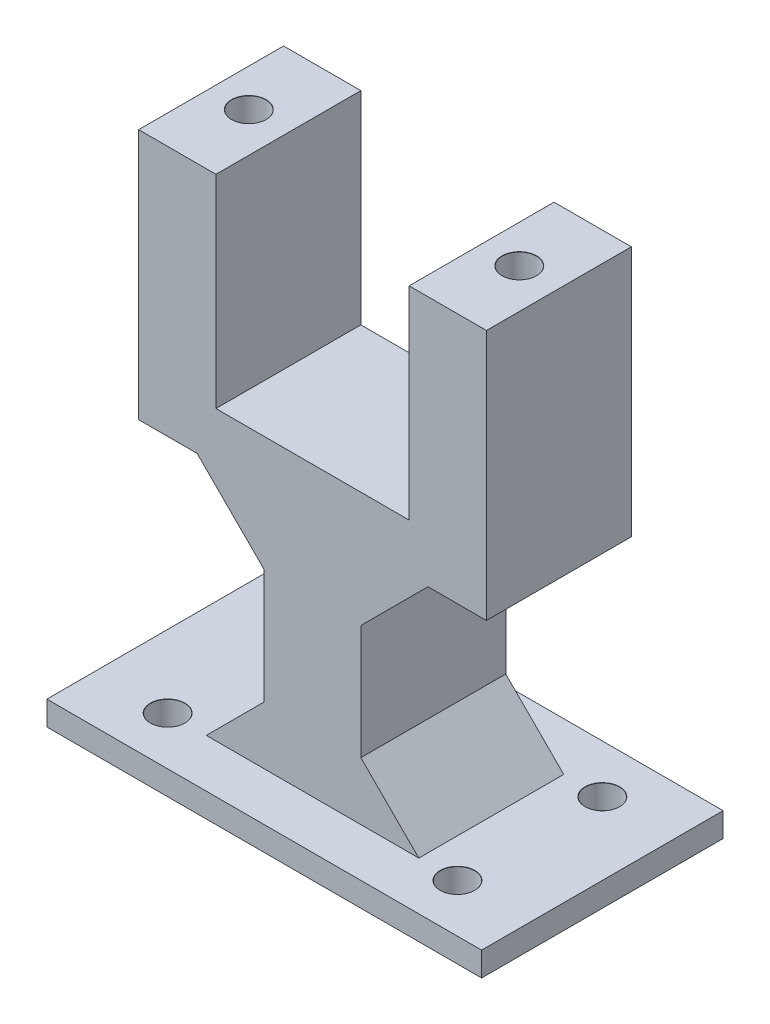
ISO-10303-21;
HEADER;
FILE_DESCRIPTION(('STEP AP214'),'2;1');
FILE_NAME('part.step','',(''),(''),'','','');
FILE_SCHEMA(('AUTOMOTIVE_DESIGN { 1 0 10303 214 1 1 1 1 }'));
ENDSEC;
DATA;
#1=APPLICATION_CONTEXT('core data for automotive mechanical design processes');
#2=APPLICATION_PROTOCOL_DEFINITION('international standard','automotive_design',2000,#1);
#3=PRODUCT_CONTEXT('',#1,'mechanical');
#4=PRODUCT('Part','Part','',(#3));
#5=PRODUCT_RELATED_PRODUCT_CATEGORY('part','',(#4));
#6=PRODUCT_DEFINITION_FORMATION('','',#4);
#7=PRODUCT_DEFINITION_CONTEXT('part definition',#1,'design');
#8=PRODUCT_DEFINITION('design','',#6,#7);
#9=PRODUCT_DEFINITION_SHAPE('','',#8);
#10=(LENGTH_UNIT() NAMED_UNIT(*) SI_UNIT(.MILLI.,.METRE.));
#11=(NAMED_UNIT(*) PLANE_ANGLE_UNIT() SI_UNIT($,.RADIAN.));
#12=(NAMED_UNIT(*) SI_UNIT($,.STERADIAN.) SOLID_ANGLE_UNIT());
#13=UNCERTAINTY_MEASURE_WITH_UNIT(LENGTH_MEASURE(1.E-05),#10,'distance_accuracy_value','');
#14=(GEOMETRIC_REPRESENTATION_CONTEXT(3) GLOBAL_UNCERTAINTY_ASSIGNED_CONTEXT((#13)) GLOBAL_UNIT_ASSIGNED_CONTEXT((#10,
#11,#12)) REPRESENTATION_CONTEXT('',''));
#15=CARTESIAN_POINT('',(0.,0.,0.));
#16=DIRECTION('',(0.,0.,1.));
#17=DIRECTION('',(1.,0.,0.));
#18=AXIS2_PLACEMENT_3D('',#15,#16,#17);
#19=CARTESIAN_POINT('',(-6.35,3.175,9.525));
#20=DIRECTION('',(1.,0.,0.));
#21=DIRECTION('',(0.,1.,0.));
#22=AXIS2_PLACEMENT_3D('',#19,#20,#21);
#23=PLANE('',#22);
#24=DIRECTION('',(0.,0.,-1.));
#25=VECTOR('',#24,1.);
#26=CARTESIAN_POINT('',(-6.35,10.795,9.525));
#27=LINE('',#26,#25);
#28=CARTESIAN_POINT('',(-6.35,10.795,9.525));
#29=VERTEX_POINT('',#28);
#30=CARTESIAN_POINT('',(-6.35,10.795,-9.525));
#31=VERTEX_POINT('',#30);
#32=EDGE_CURVE('E816',#29,#31,#27,.T.);
#33=ORIENTED_EDGE('',*,*,#32,.F.);
#34=DIRECTION('',(0.,-1.,0.));
#35=VECTOR('',#34,1.);
#36=CARTESIAN_POINT('',(-6.35,3.175,9.525));
#37=LINE('',#36,#35);
#38=CARTESIAN_POINT('',(-6.35,25.8459459212804,9.525));
#39=VERTEX_POINT('',#38);
#40=EDGE_CURVE('E197',#39,#29,#37,.T.);
#41=ORIENTED_EDGE('',*,*,#40,.F.);
#42=DIRECTION('',(0.,0.,-1.));
#43=VECTOR('',#42,1.);
#44=CARTESIAN_POINT('',(-6.34999999999999,25.8459459212804,9.525));
#45=LINE('',#44,#43);
#46=CARTESIAN_POINT('',(-6.34999999999999,25.8459459212804,-9.525));
#47=VERTEX_POINT('',#46);
#48=EDGE_CURVE('E195',#39,#47,#45,.T.);
#49=ORIENTED_EDGE('',*,*,#48,.T.);
#50=DIRECTION('',(0.,-1.,0.));
#51=VECTOR('',#50,1.);
#52=CARTESIAN_POINT('',(-6.35,3.175,-9.525));
#53=LINE('',#52,#51);
#54=EDGE_CURVE('E182',#47,#31,#53,.T.);
#55=ORIENTED_EDGE('',*,*,#54,.T.);
#56=EDGE_LOOP('',(#33,#41,#49,#55));
#57=FACE_BOUND('',#56,.T.);
#58=ADVANCED_FACE('F46',(#57),#23,.F.);
#59=CARTESIAN_POINT('',(0.,3.175,0.));
#60=DIRECTION('',(0.,1.,0.));
#61=DIRECTION('',(0.,0.,1.));
#62=AXIS2_PLACEMENT_3D('',#59,#60,#61);
#63=PLANE('',#62);
#64=CARTESIAN_POINT('',(-19.05,3.175,-9.525));
#65=DIRECTION('',(0.,1.,0.));
#66=DIRECTION('',(0.,0.,1.));
#67=AXIS2_PLACEMENT_3D('',#64,#65,#66);
#68=CIRCLE('',#67,2.275);
#69=CARTESIAN_POINT('',(-19.05,3.175,-7.25));
#70=VERTEX_POINT('',#69);
#71=EDGE_CURVE('E284',#70,#70,#68,.T.);
#72=ORIENTED_EDGE('',*,*,#71,.F.);
#73=EDGE_LOOP('',(#72));
#74=FACE_BOUND('',#73,.T.);
#75=CARTESIAN_POINT('',(19.05,3.175,-9.525));
#76=DIRECTION('',(0.,1.,0.));
#77=DIRECTION('',(0.,0.,1.));
#78=AXIS2_PLACEMENT_3D('',#75,#76,#77);
#79=CIRCLE('',#78,2.275);
#80=CARTESIAN_POINT('',(19.05,3.175,-7.25));
#81=VERTEX_POINT('',#80);
#82=EDGE_CURVE('E298',#81,#81,#79,.T.);
#83=ORIENTED_EDGE('',*,*,#82,.F.);
#84=EDGE_LOOP('',(#83));
#85=FACE_BOUND('',#84,.T.);
#86=CARTESIAN_POINT('',(19.05,3.175,9.525));
#87=DIRECTION('',(0.,1.,0.));
#88=DIRECTION('',(0.,0.,1.));
#89=AXIS2_PLACEMENT_3D('',#86,#87,#88);
#90=CIRCLE('',#89,2.275);
#91=CARTESIAN_POINT('',(19.05,3.175,11.8));
#92=VERTEX_POINT('',#91);
#93=EDGE_CURVE('E307',#92,#92,#90,.T.);
#94=ORIENTED_EDGE('',*,*,#93,.F.);
#95=EDGE_LOOP('',(#94));
#96=FACE_BOUND('',#95,.T.);
#97=CARTESIAN_POINT('',(-19.05,3.175,9.525));
#98=DIRECTION('',(0.,1.,0.));
#99=DIRECTION('',(0.,0.,1.));
#100=AXIS2_PLACEMENT_3D('',#97,#98,#99);
#101=CIRCLE('',#100,2.275);
#102=CARTESIAN_POINT('',(-19.05,3.175,11.8));
#103=VERTEX_POINT('',#102);
#104=EDGE_CURVE('E316',#103,#103,#101,.T.);
#105=ORIENTED_EDGE('',*,*,#104,.F.);
#106=EDGE_LOOP('',(#105));
#107=FACE_BOUND('',#106,.T.);
#108=DIRECTION('',(0.,0.,1.));
#109=VECTOR('',#108,1.);
#110=CARTESIAN_POINT('',(-28.575,3.175,-15.875));
#111=LINE('',#110,#109);
#112=CARTESIAN_POINT('',(-28.575,3.175,-15.875));
#113=VERTEX_POINT('',#112);
#114=CARTESIAN_POINT('',(-28.575,3.175,15.875));
#115=VERTEX_POINT('',#114);
#116=EDGE_CURVE('E326',#113,#115,#111,.T.);
#117=ORIENTED_EDGE('',*,*,#116,.T.);
#118=DIRECTION('',(1.,0.,0.));
#119=VECTOR('',#118,1.);
#120=CARTESIAN_POINT('',(-28.575,3.175,15.875));
#121=LINE('',#120,#119);
#122=CARTESIAN_POINT('',(28.575,3.175,15.875));
#123=VERTEX_POINT('',#122);
#124=EDGE_CURVE('E329',#115,#123,#121,.T.);
#125=ORIENTED_EDGE('',*,*,#124,.T.);
#126=DIRECTION('',(0.,0.,-1.));
#127=VECTOR('',#126,1.);
#128=CARTESIAN_POINT('',(28.575,3.175,-15.875));
#129=LINE('',#128,#127);
#130=CARTESIAN_POINT('',(28.575,3.175,-15.875));
#131=VERTEX_POINT('',#130);
#132=EDGE_CURVE('E332',#123,#131,#129,.T.);
#133=ORIENTED_EDGE('',*,*,#132,.T.);
#134=DIRECTION('',(-1.,0.,0.));
#135=VECTOR('',#134,1.);
#136=CARTESIAN_POINT('',(-28.575,3.175,-15.875));
#137=LINE('',#136,#135);
#138=EDGE_CURVE('E334',#131,#113,#137,.T.);
#139=ORIENTED_EDGE('',*,*,#138,.T.);
#140=EDGE_LOOP('',(#117,#125,#133,#139));
#141=FACE_BOUND('',#140,.T.);
#142=DIRECTION('',(1.,0.,0.));
#143=VECTOR('',#142,1.);
#144=CARTESIAN_POINT('',(-6.35,3.175,9.525));
#145=LINE('',#144,#143);
#146=CARTESIAN_POINT('',(-13.9700000000001,3.175,9.525));
#147=VERTEX_POINT('',#146);
#148=CARTESIAN_POINT('',(13.9700000000001,3.175,9.525));
#149=VERTEX_POINT('',#148);
#150=EDGE_CURVE('E61',#147,#149,#145,.T.);
#151=ORIENTED_EDGE('',*,*,#150,.F.);
#152=DIRECTION('',(0.,0.,-1.));
#153=VECTOR('',#152,1.);
#154=CARTESIAN_POINT('',(-13.9700000000001,3.175,9.525));
#155=LINE('',#154,#153);
#156=CARTESIAN_POINT('',(-13.9700000000001,3.175,-9.525));
#157=VERTEX_POINT('',#156);
#158=EDGE_CURVE('E815',#147,#157,#155,.T.);
#159=ORIENTED_EDGE('',*,*,#158,.T.);
#160=DIRECTION('',(1.,0.,0.));
#161=VECTOR('',#160,1.);
#162=CARTESIAN_POINT('',(-6.35,3.175,-9.525));
#163=LINE('',#162,#161);
#164=CARTESIAN_POINT('',(13.9700000000001,3.175,-9.525));
#165=VERTEX_POINT('',#164);
#166=EDGE_CURVE('E69',#157,#165,#163,.T.);
#167=ORIENTED_EDGE('',*,*,#166,.T.);
#168=DIRECTION('',(0.,0.,-1.));
#169=VECTOR('',#168,1.);
#170=CARTESIAN_POINT('',(13.9700000000001,3.175,9.525));
#171=LINE('',#170,#169);
#172=EDGE_CURVE('E221',#149,#165,#171,.T.);
#173=ORIENTED_EDGE('',*,*,#172,.F.);
#174=EDGE_LOOP('',(#151,#159,#167,#173));
#175=FACE_BOUND('',#174,.T.);
#176=ADVANCED_FACE('F368',(#74,#85,#96,#107,#141,#175),#63,.T.);
#177=CARTESIAN_POINT('',(6.35,3.175,9.525));
#178=DIRECTION('',(-1.,0.,0.));
#179=DIRECTION('',(0.,-1.,0.));
#180=AXIS2_PLACEMENT_3D('',#177,#178,#179);
#181=PLANE('',#180);
#182=DIRECTION('',(0.,0.,-1.));
#183=VECTOR('',#182,1.);
#184=CARTESIAN_POINT('',(6.35,10.795,9.525));
#185=LINE('',#184,#183);
#186=CARTESIAN_POINT('',(6.35,10.795,9.525));
#187=VERTEX_POINT('',#186);
#188=CARTESIAN_POINT('',(6.35,10.795,-9.525));
#189=VERTEX_POINT('',#188);
#190=EDGE_CURVE('E230',#187,#189,#185,.T.);
#191=ORIENTED_EDGE('',*,*,#190,.T.);
#192=DIRECTION('',(0.,1.,0.));
#193=VECTOR('',#192,1.);
#194=CARTESIAN_POINT('',(6.35,3.175,-9.525));
#195=LINE('',#194,#193);
#196=CARTESIAN_POINT('',(6.35,25.8459459212804,-9.525));
#197=VERTEX_POINT('',#196);
#198=EDGE_CURVE('E287',#189,#197,#195,.T.);
#199=ORIENTED_EDGE('',*,*,#198,.T.);
#200=DIRECTION('',(0.,0.,-1.));
#201=VECTOR('',#200,1.);
#202=CARTESIAN_POINT('',(6.35,25.8459459212804,9.525));
#203=LINE('',#202,#201);
#204=CARTESIAN_POINT('',(6.35,25.8459459212804,9.525));
#205=VERTEX_POINT('',#204);
#206=EDGE_CURVE('E192',#205,#197,#203,.T.);
#207=ORIENTED_EDGE('',*,*,#206,.F.);
#208=DIRECTION('',(0.,1.,0.));
#209=VECTOR('',#208,1.);
#210=CARTESIAN_POINT('',(6.35,3.175,9.525));
#211=LINE('',#210,#209);
#212=EDGE_CURVE('E281',#187,#205,#211,.T.);
#213=ORIENTED_EDGE('',*,*,#212,.F.);
#214=EDGE_LOOP('',(#191,#199,#207,#213));
#215=FACE_BOUND('',#214,.T.);
#216=ADVANCED_FACE('F376',(#215),#181,.F.);
#217=CARTESIAN_POINT('',(-28.575,3.175,-15.875));
#218=DIRECTION('',(1.,0.,0.));
#219=DIRECTION('',(0.,0.,-1.));
#220=AXIS2_PLACEMENT_3D('',#217,#218,#219);
#221=PLANE('',#220);
#222=DIRECTION('',(0.,0.,1.));
#223=VECTOR('',#222,1.);
#224=CARTESIAN_POINT('',(-28.575,0.,-15.875));
#225=LINE('',#224,#223);
#226=CARTESIAN_POINT('',(-28.575,0.,-15.875));
#227=VERTEX_POINT('',#226);
#228=CARTESIAN_POINT('',(-28.575,0.,15.875));
#229=VERTEX_POINT('',#228);
#230=EDGE_CURVE('E325',#227,#229,#225,.T.);
#231=ORIENTED_EDGE('',*,*,#230,.T.);
#232=DIRECTION('',(0.,-1.,0.));
#233=VECTOR('',#232,1.);
#234=CARTESIAN_POINT('',(-28.575,3.175,15.875));
#235=LINE('',#234,#233);
#236=EDGE_CURVE('E11',#115,#229,#235,.T.);
#237=ORIENTED_EDGE('',*,*,#236,.F.);
#238=ORIENTED_EDGE('',*,*,#116,.F.);
#239=DIRECTION('',(0.,-1.,0.));
#240=VECTOR('',#239,1.);
#241=CARTESIAN_POINT('',(-28.575,3.175,-15.875));
#242=LINE('',#241,#240);
#243=EDGE_CURVE('E336',#113,#227,#242,.T.);
#244=ORIENTED_EDGE('',*,*,#243,.T.);
#245=EDGE_LOOP('',(#231,#237,#238,#244));
#246=FACE_BOUND('',#245,.T.);
#247=ADVANCED_FACE('F48',(#246),#221,.F.);
#248=CARTESIAN_POINT('',(-28.575,3.175,15.875));
#249=DIRECTION('',(0.,0.,-1.));
#250=DIRECTION('',(-1.,0.,0.));
#251=AXIS2_PLACEMENT_3D('',#248,#249,#250);
#252=PLANE('',#251);
#253=DIRECTION('',(1.,0.,0.));
#254=VECTOR('',#253,1.);
#255=CARTESIAN_POINT('',(-28.575,0.,15.875));
#256=LINE('',#255,#254);
#257=CARTESIAN_POINT('',(28.575,0.,15.875));
#258=VERTEX_POINT('',#257);
#259=EDGE_CURVE('E339',#229,#258,#256,.T.);
#260=ORIENTED_EDGE('',*,*,#259,.T.);
#261=DIRECTION('',(0.,-1.,0.));
#262=VECTOR('',#261,1.);
#263=CARTESIAN_POINT('',(28.575,3.175,15.875));
#264=LINE('',#263,#262);
#265=EDGE_CURVE('E54',#123,#258,#264,.T.);
#266=ORIENTED_EDGE('',*,*,#265,.F.);
#267=ORIENTED_EDGE('',*,*,#124,.F.);
#268=ORIENTED_EDGE('',*,*,#236,.T.);
#269=EDGE_LOOP('',(#260,#266,#267,#268));
#270=FACE_BOUND('',#269,.T.);
#271=ADVANCED_FACE('F369',(#270),#252,.F.);
#272=CARTESIAN_POINT('',(28.575,3.175,-15.875));
#273=DIRECTION('',(-1.,0.,0.));
#274=DIRECTION('',(0.,0.,1.));
#275=AXIS2_PLACEMENT_3D('',#272,#273,#274);
#276=PLANE('',#275);
#277=DIRECTION('',(0.,0.,-1.));
#278=VECTOR('',#277,1.);
#279=CARTESIAN_POINT('',(28.575,0.,-15.875));
#280=LINE('',#279,#278);
#281=CARTESIAN_POINT('',(28.575,0.,-15.875));
#282=VERTEX_POINT('',#281);
#283=EDGE_CURVE('E341',#258,#282,#280,.T.);
#284=ORIENTED_EDGE('',*,*,#283,.T.);
#285=DIRECTION('',(0.,-1.,0.));
#286=VECTOR('',#285,1.);
#287=CARTESIAN_POINT('',(28.575,3.175,-15.875));
#288=LINE('',#287,#286);
#289=EDGE_CURVE('E346',#131,#282,#288,.T.);
#290=ORIENTED_EDGE('',*,*,#289,.F.);
#291=ORIENTED_EDGE('',*,*,#132,.F.);
#292=ORIENTED_EDGE('',*,*,#265,.T.);
#293=EDGE_LOOP('',(#284,#290,#291,#292));
#294=FACE_BOUND('',#293,.T.);
#295=ADVANCED_FACE('F353',(#294),#276,.F.);
#296=CARTESIAN_POINT('',(-28.575,3.175,-15.875));
#297=DIRECTION('',(0.,0.,1.));
#298=DIRECTION('',(1.,0.,0.));
#299=AXIS2_PLACEMENT_3D('',#296,#297,#298);
#300=PLANE('',#299);
#301=DIRECTION('',(-1.,0.,0.));
#302=VECTOR('',#301,1.);
#303=CARTESIAN_POINT('',(-28.575,0.,-15.875));
#304=LINE('',#303,#302);
#305=EDGE_CURVE('E330',#282,#227,#304,.T.);
#306=ORIENTED_EDGE('',*,*,#305,.T.);
#307=ORIENTED_EDGE('',*,*,#243,.F.);
#308=ORIENTED_EDGE('',*,*,#138,.F.);
#309=ORIENTED_EDGE('',*,*,#289,.T.);
#310=EDGE_LOOP('',(#306,#307,#308,#309));
#311=FACE_BOUND('',#310,.T.);
#312=ADVANCED_FACE('F362',(#311),#300,.F.);
#313=CARTESIAN_POINT('',(0.,0.,0.));
#314=DIRECTION('',(0.,1.,0.));
#315=DIRECTION('',(0.,0.,1.));
#316=AXIS2_PLACEMENT_3D('',#313,#314,#315);
#317=PLANE('',#316);
#318=CARTESIAN_POINT('',(-19.05,0.,-9.525));
#319=DIRECTION('',(0.,1.,0.));
#320=DIRECTION('',(0.,0.,1.));
#321=AXIS2_PLACEMENT_3D('',#318,#319,#320);
#322=CIRCLE('',#321,2.25);
#323=CARTESIAN_POINT('',(-19.05,0.,-7.27500000000001));
#324=VERTEX_POINT('',#323);
#325=EDGE_CURVE('E295',#324,#324,#322,.T.);
#326=ORIENTED_EDGE('',*,*,#325,.T.);
#327=EDGE_LOOP('',(#326));
#328=FACE_BOUND('',#327,.T.);
#329=CARTESIAN_POINT('',(19.05,0.,-9.525));
#330=DIRECTION('',(0.,1.,0.));
#331=DIRECTION('',(0.,0.,1.));
#332=AXIS2_PLACEMENT_3D('',#329,#330,#331);
#333=CIRCLE('',#332,2.25);
#334=CARTESIAN_POINT('',(19.05,0.,-7.27500000000001));
#335=VERTEX_POINT('',#334);
#336=EDGE_CURVE('E304',#335,#335,#333,.T.);
#337=ORIENTED_EDGE('',*,*,#336,.T.);
#338=EDGE_LOOP('',(#337));
#339=FACE_BOUND('',#338,.T.);
#340=CARTESIAN_POINT('',(19.05,0.,9.525));
#341=DIRECTION('',(0.,1.,0.));
#342=DIRECTION('',(0.,0.,1.));
#343=AXIS2_PLACEMENT_3D('',#340,#341,#342);
#344=CIRCLE('',#343,2.25);
#345=CARTESIAN_POINT('',(19.05,0.,11.775));
#346=VERTEX_POINT('',#345);
#347=EDGE_CURVE('E313',#346,#346,#344,.T.);
#348=ORIENTED_EDGE('',*,*,#347,.T.);
#349=EDGE_LOOP('',(#348));
#350=FACE_BOUND('',#349,.T.);
#351=CARTESIAN_POINT('',(-19.05,0.,9.525));
#352=DIRECTION('',(0.,1.,0.));
#353=DIRECTION('',(0.,0.,1.));
#354=AXIS2_PLACEMENT_3D('',#351,#352,#353);
#355=CIRCLE('',#354,2.25);
#356=CARTESIAN_POINT('',(-19.05,0.,11.775));
#357=VERTEX_POINT('',#356);
#358=EDGE_CURVE('E322',#357,#357,#355,.T.);
#359=ORIENTED_EDGE('',*,*,#358,.T.);
#360=EDGE_LOOP('',(#359));
#361=FACE_BOUND('',#360,.T.);
#362=ORIENTED_EDGE('',*,*,#230,.F.);
#363=ORIENTED_EDGE('',*,*,#305,.F.);
#364=ORIENTED_EDGE('',*,*,#283,.F.);
#365=ORIENTED_EDGE('',*,*,#259,.F.);
#366=EDGE_LOOP('',(#362,#363,#364,#365));
#367=FACE_BOUND('',#366,.T.);
#368=ADVANCED_FACE('F359',(#328,#339,#350,#361,#367),#317,.F.);
#369=CARTESIAN_POINT('',(-19.05,3.175,9.525));
#370=DIRECTION('',(0.,1.,0.));
#371=DIRECTION('',(0.,0.,1.));
#372=AXIS2_PLACEMENT_3D('',#369,#370,#371);
#373=CYLINDRICAL_SURFACE('',#372,2.25);
#374=ORIENTED_EDGE('',*,*,#358,.F.);
#375=EDGE_LOOP('',(#374));
#376=FACE_BOUND('',#375,.T.);
#377=CARTESIAN_POINT('',(-19.05,3.15,9.525));
#378=DIRECTION('',(0.,1.,0.));
#379=DIRECTION('',(0.,0.,1.));
#380=AXIS2_PLACEMENT_3D('',#377,#378,#379);
#381=CIRCLE('',#380,2.25);
#382=CARTESIAN_POINT('',(-19.05,3.15,11.775));
#383=VERTEX_POINT('',#382);
#384=EDGE_CURVE('E319',#383,#383,#381,.T.);
#385=ORIENTED_EDGE('',*,*,#384,.T.);
#386=EDGE_LOOP('',(#385));
#387=FACE_BOUND('',#386,.T.);
#388=ADVANCED_FACE('F415',(#376,#387),#373,.F.);
#389=CARTESIAN_POINT('',(-19.05,3.175,9.525));
#390=DIRECTION('',(0.,1.,0.));
#391=DIRECTION('',(0.,0.,1.));
#392=AXIS2_PLACEMENT_3D('',#389,#390,#391);
#393=CONICAL_SURFACE('',#392,2.275,0.78539816339744);
#394=ORIENTED_EDGE('',*,*,#384,.F.);
#395=EDGE_LOOP('',(#394));
#396=FACE_BOUND('',#395,.T.);
#397=ORIENTED_EDGE('',*,*,#104,.T.);
#398=EDGE_LOOP('',(#397));
#399=FACE_BOUND('',#398,.T.);
#400=ADVANCED_FACE('F411',(#396,#399),#393,.F.);
#401=CARTESIAN_POINT('',(19.05,3.175,9.525));
#402=DIRECTION('',(0.,1.,0.));
#403=DIRECTION('',(0.,0.,1.));
#404=AXIS2_PLACEMENT_3D('',#401,#402,#403);
#405=CYLINDRICAL_SURFACE('',#404,2.25);
#406=ORIENTED_EDGE('',*,*,#347,.F.);
#407=EDGE_LOOP('',(#406));
#408=FACE_BOUND('',#407,.T.);
#409=CARTESIAN_POINT('',(19.05,3.15,9.525));
#410=DIRECTION('',(0.,1.,0.));
#411=DIRECTION('',(0.,0.,1.));
#412=AXIS2_PLACEMENT_3D('',#409,#410,#411);
#413=CIRCLE('',#412,2.25);
#414=CARTESIAN_POINT('',(19.05,3.15,11.775));
#415=VERTEX_POINT('',#414);
#416=EDGE_CURVE('E310',#415,#415,#413,.T.);
#417=ORIENTED_EDGE('',*,*,#416,.T.);
#418=EDGE_LOOP('',(#417));
#419=FACE_BOUND('',#418,.T.);
#420=ADVANCED_FACE('F407',(#408,#419),#405,.F.);
#421=CARTESIAN_POINT('',(19.05,3.175,9.525));
#422=DIRECTION('',(0.,1.,0.));
#423=DIRECTION('',(0.,0.,1.));
#424=AXIS2_PLACEMENT_3D('',#421,#422,#423);
#425=CONICAL_SURFACE('',#424,2.275,0.78539816339744);
#426=ORIENTED_EDGE('',*,*,#416,.F.);
#427=EDGE_LOOP('',(#426));
#428=FACE_BOUND('',#427,.T.);
#429=ORIENTED_EDGE('',*,*,#93,.T.);
#430=EDGE_LOOP('',(#429));
#431=FACE_BOUND('',#430,.T.);
#432=ADVANCED_FACE('F403',(#428,#431),#425,.F.);
#433=CARTESIAN_POINT('',(19.05,3.175,-9.525));
#434=DIRECTION('',(0.,1.,0.));
#435=DIRECTION('',(0.,0.,1.));
#436=AXIS2_PLACEMENT_3D('',#433,#434,#435);
#437=CYLINDRICAL_SURFACE('',#436,2.25);
#438=ORIENTED_EDGE('',*,*,#336,.F.);
#439=EDGE_LOOP('',(#438));
#440=FACE_BOUND('',#439,.T.);
#441=CARTESIAN_POINT('',(19.05,3.15,-9.525));
#442=DIRECTION('',(0.,1.,0.));
#443=DIRECTION('',(0.,0.,1.));
#444=AXIS2_PLACEMENT_3D('',#441,#442,#443);
#445=CIRCLE('',#444,2.25);
#446=CARTESIAN_POINT('',(19.05,3.15,-7.27500000000001));
#447=VERTEX_POINT('',#446);
#448=EDGE_CURVE('E301',#447,#447,#445,.T.);
#449=ORIENTED_EDGE('',*,*,#448,.T.);
#450=EDGE_LOOP('',(#449));
#451=FACE_BOUND('',#450,.T.);
#452=ADVANCED_FACE('F399',(#440,#451),#437,.F.);
#453=CARTESIAN_POINT('',(19.05,3.175,-9.525));
#454=DIRECTION('',(0.,1.,0.));
#455=DIRECTION('',(0.,0.,1.));
#456=AXIS2_PLACEMENT_3D('',#453,#454,#455);
#457=CONICAL_SURFACE('',#456,2.275,0.78539816339744);
#458=ORIENTED_EDGE('',*,*,#448,.F.);
#459=EDGE_LOOP('',(#458));
#460=FACE_BOUND('',#459,.T.);
#461=ORIENTED_EDGE('',*,*,#82,.T.);
#462=EDGE_LOOP('',(#461));
#463=FACE_BOUND('',#462,.T.);
#464=ADVANCED_FACE('F395',(#460,#463),#457,.F.);
#465=CARTESIAN_POINT('',(-19.05,3.175,-9.525));
#466=DIRECTION('',(0.,1.,0.));
#467=DIRECTION('',(0.,0.,1.));
#468=AXIS2_PLACEMENT_3D('',#465,#466,#467);
#469=CYLINDRICAL_SURFACE('',#468,2.25);
#470=ORIENTED_EDGE('',*,*,#325,.F.);
#471=EDGE_LOOP('',(#470));
#472=FACE_BOUND('',#471,.T.);
#473=CARTESIAN_POINT('',(-19.05,3.15,-9.525));
#474=DIRECTION('',(0.,1.,0.));
#475=DIRECTION('',(0.,0.,1.));
#476=AXIS2_PLACEMENT_3D('',#473,#474,#475);
#477=CIRCLE('',#476,2.25);
#478=CARTESIAN_POINT('',(-19.05,3.15,-7.27500000000001));
#479=VERTEX_POINT('',#478);
#480=EDGE_CURVE('E292',#479,#479,#477,.T.);
#481=ORIENTED_EDGE('',*,*,#480,.T.);
#482=EDGE_LOOP('',(#481));
#483=FACE_BOUND('',#482,.T.);
#484=ADVANCED_FACE('F391',(#472,#483),#469,.F.);
#485=CARTESIAN_POINT('',(-19.05,3.175,-9.525));
#486=DIRECTION('',(0.,1.,0.));
#487=DIRECTION('',(0.,0.,1.));
#488=AXIS2_PLACEMENT_3D('',#485,#486,#487);
#489=CONICAL_SURFACE('',#488,2.275,0.78539816339744);
#490=ORIENTED_EDGE('',*,*,#480,.F.);
#491=EDGE_LOOP('',(#490));
#492=FACE_BOUND('',#491,.T.);
#493=ORIENTED_EDGE('',*,*,#71,.T.);
#494=EDGE_LOOP('',(#493));
#495=FACE_BOUND('',#494,.T.);
#496=ADVANCED_FACE('F387',(#492,#495),#489,.F.);
#497=CARTESIAN_POINT('',(-6.35,41.021,9.525));
#498=DIRECTION('',(0.,-1.,0.));
#499=DIRECTION('',(0.,0.,-1.));
#500=AXIS2_PLACEMENT_3D('',#497,#498,#499);
#501=PLANE('',#500);
#502=DIRECTION('',(-1.,0.,0.));
#503=VECTOR('',#502,1.);
#504=CARTESIAN_POINT('',(-6.35,41.021,-9.525));
#505=LINE('',#504,#503);
#506=CARTESIAN_POINT('',(12.7,41.021,-9.525));
#507=VERTEX_POINT('',#506);
#508=CARTESIAN_POINT('',(-12.7,41.021,-9.525));
#509=VERTEX_POINT('',#508);
#510=EDGE_CURVE('E279',#507,#509,#505,.T.);
#511=ORIENTED_EDGE('',*,*,#510,.T.);
#512=DIRECTION('',(0.,0.,-1.));
#513=VECTOR('',#512,1.);
#514=CARTESIAN_POINT('',(-12.7,41.021,9.525));
#515=LINE('',#514,#513);
#516=CARTESIAN_POINT('',(-12.7,41.021,9.525));
#517=VERTEX_POINT('',#516);
#518=EDGE_CURVE('E818',#517,#509,#515,.T.);
#519=ORIENTED_EDGE('',*,*,#518,.F.);
#520=DIRECTION('',(-1.,0.,0.));
#521=VECTOR('',#520,1.);
#522=CARTESIAN_POINT('',(-6.35,41.021,9.525));
#523=LINE('',#522,#521);
#524=CARTESIAN_POINT('',(12.7,41.021,9.525));
#525=VERTEX_POINT('',#524);
#526=EDGE_CURVE('E283',#525,#517,#523,.T.);
#527=ORIENTED_EDGE('',*,*,#526,.F.);
#528=DIRECTION('',(0.,0.,-1.));
#529=VECTOR('',#528,1.);
#530=CARTESIAN_POINT('',(12.7,41.021,9.525));
#531=LINE('',#530,#529);
#532=EDGE_CURVE('E252',#525,#507,#531,.T.);
#533=ORIENTED_EDGE('',*,*,#532,.T.);
#534=EDGE_LOOP('',(#511,#519,#527,#533));
#535=FACE_BOUND('',#534,.T.);
#536=ADVANCED_FACE('F390',(#535),#501,.F.);
#537=CARTESIAN_POINT('',(0.,0.,9.525));
#538=DIRECTION('',(0.,0.,-1.));
#539=DIRECTION('',(-1.,0.,0.));
#540=AXIS2_PLACEMENT_3D('',#537,#538,#539);
#541=PLANE('',#540);
#542=ORIENTED_EDGE('',*,*,#526,.T.);
#543=DIRECTION('',(0.,1.,0.));
#544=VECTOR('',#543,1.);
#545=CARTESIAN_POINT('',(-12.7,41.021,9.525));
#546=LINE('',#545,#544);
#547=CARTESIAN_POINT('',(-12.7,67.691,9.525));
#548=VERTEX_POINT('',#547);
#549=EDGE_CURVE('E208',#517,#548,#546,.T.);
#550=ORIENTED_EDGE('',*,*,#549,.T.);
#551=DIRECTION('',(-1.,0.,0.));
#552=VECTOR('',#551,1.);
#553=CARTESIAN_POINT('',(-12.7,67.691,9.525));
#554=LINE('',#553,#552);
#555=CARTESIAN_POINT('',(-22.86,67.691,9.525));
#556=VERTEX_POINT('',#555);
#557=EDGE_CURVE('E212',#548,#556,#554,.T.);
#558=ORIENTED_EDGE('',*,*,#557,.T.);
#559=DIRECTION('',(0.,-1.,0.));
#560=VECTOR('',#559,1.);
#561=CARTESIAN_POINT('',(-22.86,67.691,9.525));
#562=LINE('',#561,#560);
#563=CARTESIAN_POINT('',(-22.86,34.671,9.525));
#564=VERTEX_POINT('',#563);
#565=EDGE_CURVE('E225',#556,#564,#562,.T.);
#566=ORIENTED_EDGE('',*,*,#565,.T.);
#567=DIRECTION('',(1.,0.,0.));
#568=VECTOR('',#567,1.);
#569=CARTESIAN_POINT('',(-22.86,34.671,9.525));
#570=LINE('',#569,#568);
#571=CARTESIAN_POINT('',(-15.1750540787195,34.671,9.525));
#572=VERTEX_POINT('',#571);
#573=EDGE_CURVE('E223',#564,#572,#570,.T.);
#574=ORIENTED_EDGE('',*,*,#573,.T.);
#575=DIRECTION('',(0.707106781186544,-0.707106781186551,0.));
#576=VECTOR('',#575,1.);
#577=CARTESIAN_POINT('',(-15.1750540787195,34.671,9.525));
#578=LINE('',#577,#576);
#579=EDGE_CURVE('E201',#572,#39,#578,.T.);
#580=ORIENTED_EDGE('',*,*,#579,.T.);
#581=ORIENTED_EDGE('',*,*,#40,.T.);
#582=DIRECTION('',(-0.707106781186551,-0.707106781186544,0.));
#583=VECTOR('',#582,1.);
#584=CARTESIAN_POINT('',(-6.35,10.795,9.525));
#585=LINE('',#584,#583);
#586=EDGE_CURVE('E813',#29,#147,#585,.T.);
#587=ORIENTED_EDGE('',*,*,#586,.T.);
#588=ORIENTED_EDGE('',*,*,#150,.T.);
#589=DIRECTION('',(-0.707106781186551,0.707106781186544,0.));
#590=VECTOR('',#589,1.);
#591=CARTESIAN_POINT('',(6.35,10.795,9.525));
#592=LINE('',#591,#590);
#593=EDGE_CURVE('E233',#149,#187,#592,.T.);
#594=ORIENTED_EDGE('',*,*,#593,.T.);
#595=ORIENTED_EDGE('',*,*,#212,.T.);
#596=DIRECTION('',(0.707106781186543,0.707106781186551,0.));
#597=VECTOR('',#596,1.);
#598=CARTESIAN_POINT('',(15.1750540787194,34.671,9.525));
#599=LINE('',#598,#597);
#600=CARTESIAN_POINT('',(15.1750540787194,34.671,9.525));
#601=VERTEX_POINT('',#600);
#602=EDGE_CURVE('E240',#205,#601,#599,.T.);
#603=ORIENTED_EDGE('',*,*,#602,.T.);
#604=DIRECTION('',(1.,0.,0.));
#605=VECTOR('',#604,1.);
#606=CARTESIAN_POINT('',(22.86,34.671,9.525));
#607=LINE('',#606,#605);
#608=CARTESIAN_POINT('',(22.86,34.671,9.525));
#609=VERTEX_POINT('',#608);
#610=EDGE_CURVE('E242',#601,#609,#607,.T.);
#611=ORIENTED_EDGE('',*,*,#610,.T.);
#612=DIRECTION('',(0.,1.,0.));
#613=VECTOR('',#612,1.);
#614=CARTESIAN_POINT('',(22.86,67.691,9.525));
#615=LINE('',#614,#613);
#616=CARTESIAN_POINT('',(22.86,67.691,9.525));
#617=VERTEX_POINT('',#616);
#618=EDGE_CURVE('E245',#609,#617,#615,.T.);
#619=ORIENTED_EDGE('',*,*,#618,.T.);
#620=DIRECTION('',(-1.,0.,0.));
#621=VECTOR('',#620,1.);
#622=CARTESIAN_POINT('',(12.7,67.691,9.525));
#623=LINE('',#622,#621);
#624=CARTESIAN_POINT('',(12.7,67.691,9.525));
#625=VERTEX_POINT('',#624);
#626=EDGE_CURVE('E247',#617,#625,#623,.T.);
#627=ORIENTED_EDGE('',*,*,#626,.T.);
#628=DIRECTION('',(0.,-1.,0.));
#629=VECTOR('',#628,1.);
#630=CARTESIAN_POINT('',(12.7,41.021,9.525));
#631=LINE('',#630,#629);
#632=EDGE_CURVE('E249',#625,#525,#631,.T.);
#633=ORIENTED_EDGE('',*,*,#632,.T.);
#634=EDGE_LOOP('',(#542,#550,#558,#566,#574,#580,#581,#587,#588,#594,#595,#603,#611,#619,#627,#633));
#635=FACE_BOUND('',#634,.T.);
#636=ADVANCED_FACE('F470',(#635),#541,.F.);
#637=CARTESIAN_POINT('',(0.,0.,-9.525));
#638=DIRECTION('',(0.,0.,-1.));
#639=DIRECTION('',(-1.,0.,0.));
#640=AXIS2_PLACEMENT_3D('',#637,#638,#639);
#641=PLANE('',#640);
#642=ORIENTED_EDGE('',*,*,#54,.F.);
#643=DIRECTION('',(0.707106781186544,-0.707106781186551,0.));
#644=VECTOR('',#643,1.);
#645=CARTESIAN_POINT('',(-15.1750540787195,34.671,-9.525));
#646=LINE('',#645,#644);
#647=CARTESIAN_POINT('',(-15.1750540787195,34.671,-9.525));
#648=VERTEX_POINT('',#647);
#649=EDGE_CURVE('E187',#648,#47,#646,.T.);
#650=ORIENTED_EDGE('',*,*,#649,.F.);
#651=DIRECTION('',(1.,0.,0.));
#652=VECTOR('',#651,1.);
#653=CARTESIAN_POINT('',(-22.86,34.671,-9.525));
#654=LINE('',#653,#652);
#655=CARTESIAN_POINT('',(-22.86,34.671,-9.525));
#656=VERTEX_POINT('',#655);
#657=EDGE_CURVE('E207',#656,#648,#654,.T.);
#658=ORIENTED_EDGE('',*,*,#657,.F.);
#659=DIRECTION('',(0.,-1.,0.));
#660=VECTOR('',#659,1.);
#661=CARTESIAN_POINT('',(-22.86,67.691,-9.525));
#662=LINE('',#661,#660);
#663=CARTESIAN_POINT('',(-22.86,67.691,-9.525));
#664=VERTEX_POINT('',#663);
#665=EDGE_CURVE('E210',#664,#656,#662,.T.);
#666=ORIENTED_EDGE('',*,*,#665,.F.);
#667=DIRECTION('',(-1.,0.,0.));
#668=VECTOR('',#667,1.);
#669=CARTESIAN_POINT('',(-12.7,67.691,-9.525));
#670=LINE('',#669,#668);
#671=CARTESIAN_POINT('',(-12.7,67.691,-9.525));
#672=VERTEX_POINT('',#671);
#673=EDGE_CURVE('E217',#672,#664,#670,.T.);
#674=ORIENTED_EDGE('',*,*,#673,.F.);
#675=DIRECTION('',(0.,1.,0.));
#676=VECTOR('',#675,1.);
#677=CARTESIAN_POINT('',(-12.7,41.021,-9.525));
#678=LINE('',#677,#676);
#679=EDGE_CURVE('E219',#509,#672,#678,.T.);
#680=ORIENTED_EDGE('',*,*,#679,.F.);
#681=ORIENTED_EDGE('',*,*,#510,.F.);
#682=DIRECTION('',(0.,-1.,0.));
#683=VECTOR('',#682,1.);
#684=CARTESIAN_POINT('',(12.7,41.021,-9.525));
#685=LINE('',#684,#683);
#686=CARTESIAN_POINT('',(12.7,67.691,-9.525));
#687=VERTEX_POINT('',#686);
#688=EDGE_CURVE('E243',#687,#507,#685,.T.);
#689=ORIENTED_EDGE('',*,*,#688,.F.);
#690=DIRECTION('',(-1.,0.,0.));
#691=VECTOR('',#690,1.);
#692=CARTESIAN_POINT('',(12.7,67.691,-9.525));
#693=LINE('',#692,#691);
#694=CARTESIAN_POINT('',(22.86,67.691,-9.525));
#695=VERTEX_POINT('',#694);
#696=EDGE_CURVE('E258',#695,#687,#693,.T.);
#697=ORIENTED_EDGE('',*,*,#696,.F.);
#698=DIRECTION('',(0.,1.,0.));
#699=VECTOR('',#698,1.);
#700=CARTESIAN_POINT('',(22.86,67.691,-9.525));
#701=LINE('',#700,#699);
#702=CARTESIAN_POINT('',(22.86,34.671,-9.525));
#703=VERTEX_POINT('',#702);
#704=EDGE_CURVE('E256',#703,#695,#701,.T.);
#705=ORIENTED_EDGE('',*,*,#704,.F.);
#706=DIRECTION('',(1.,0.,0.));
#707=VECTOR('',#706,1.);
#708=CARTESIAN_POINT('',(22.86,34.671,-9.525));
#709=LINE('',#708,#707);
#710=CARTESIAN_POINT('',(15.1750540787194,34.671,-9.525));
#711=VERTEX_POINT('',#710);
#712=EDGE_CURVE('E254',#711,#703,#709,.T.);
#713=ORIENTED_EDGE('',*,*,#712,.F.);
#714=DIRECTION('',(0.707106781186543,0.707106781186551,0.));
#715=VECTOR('',#714,1.);
#716=CARTESIAN_POINT('',(15.1750540787194,34.671,-9.525));
#717=LINE('',#716,#715);
#718=EDGE_CURVE('E237',#197,#711,#717,.T.);
#719=ORIENTED_EDGE('',*,*,#718,.F.);
#720=ORIENTED_EDGE('',*,*,#198,.F.);
#721=DIRECTION('',(-0.707106781186551,0.707106781186544,0.));
#722=VECTOR('',#721,1.);
#723=CARTESIAN_POINT('',(6.35,10.795,-9.525));
#724=LINE('',#723,#722);
#725=EDGE_CURVE('E234',#165,#189,#724,.T.);
#726=ORIENTED_EDGE('',*,*,#725,.F.);
#727=ORIENTED_EDGE('',*,*,#166,.F.);
#728=DIRECTION('',(-0.707106781186551,-0.707106781186544,0.));
#729=VECTOR('',#728,1.);
#730=CARTESIAN_POINT('',(-6.35,10.795,-9.525));
#731=LINE('',#730,#729);
#732=EDGE_CURVE('E189',#31,#157,#731,.T.);
#733=ORIENTED_EDGE('',*,*,#732,.F.);
#734=EDGE_LOOP('',(#642,#650,#658,#666,#674,#680,#681,#689,#697,#705,#713,#719,#720,#726,#727,#733));
#735=FACE_BOUND('',#734,.T.);
#736=ADVANCED_FACE('F184',(#735),#641,.T.);
#737=CARTESIAN_POINT('',(15.1750540787194,34.671,9.525));
#738=DIRECTION('',(-0.707106781186551,0.707106781186543,0.));
#739=DIRECTION('',(-0.707106781186544,-0.707106781186552,0.));
#740=AXIS2_PLACEMENT_3D('',#737,#738,#739);
#741=PLANE('',#740);
#742=ORIENTED_EDGE('',*,*,#718,.T.);
#743=DIRECTION('',(0.,0.,-1.));
#744=VECTOR('',#743,1.);
#745=CARTESIAN_POINT('',(15.1750540787194,34.671,9.525));
#746=LINE('',#745,#744);
#747=EDGE_CURVE('E273',#601,#711,#746,.T.);
#748=ORIENTED_EDGE('',*,*,#747,.F.);
#749=ORIENTED_EDGE('',*,*,#602,.F.);
#750=ORIENTED_EDGE('',*,*,#206,.T.);
#751=EDGE_LOOP('',(#742,#748,#749,#750));
#752=FACE_BOUND('',#751,.T.);
#753=ADVANCED_FACE('F485',(#752),#741,.F.);
#754=CARTESIAN_POINT('',(22.86,34.671,9.525));
#755=DIRECTION('',(0.,1.,0.));
#756=DIRECTION('',(0.,0.,1.));
#757=AXIS2_PLACEMENT_3D('',#754,#755,#756);
#758=PLANE('',#757);
#759=CARTESIAN_POINT('',(17.6568059132354,34.671,0.));
#760=DIRECTION('',(0.,1.,0.));
#761=DIRECTION('',(0.,0.,1.));
#762=AXIS2_PLACEMENT_3D('',#759,#760,#761);
#763=CIRCLE('',#762,2.24999999999999);
#764=CARTESIAN_POINT('',(17.6568059132354,34.671,2.24999999999999));
#765=VERTEX_POINT('',#764);
#766=EDGE_CURVE('E857',#765,#765,#763,.F.);
#767=ORIENTED_EDGE('',*,*,#766,.F.);
#768=EDGE_LOOP('',(#767));
#769=FACE_BOUND('',#768,.T.);
#770=ORIENTED_EDGE('',*,*,#712,.T.);
#771=DIRECTION('',(0.,0.,-1.));
#772=VECTOR('',#771,1.);
#773=CARTESIAN_POINT('',(22.86,34.671,9.525));
#774=LINE('',#773,#772);
#775=EDGE_CURVE('E270',#609,#703,#774,.T.);
#776=ORIENTED_EDGE('',*,*,#775,.F.);
#777=ORIENTED_EDGE('',*,*,#610,.F.);
#778=ORIENTED_EDGE('',*,*,#747,.T.);
#779=EDGE_LOOP('',(#770,#776,#777,#778));
#780=FACE_BOUND('',#779,.T.);
#781=ADVANCED_FACE('F492',(#769,#780),#758,.F.);
#782=CARTESIAN_POINT('',(22.86,67.691,9.525));
#783=DIRECTION('',(-1.,0.,0.));
#784=DIRECTION('',(0.,-1.,0.));
#785=AXIS2_PLACEMENT_3D('',#782,#783,#784);
#786=PLANE('',#785);
#787=ORIENTED_EDGE('',*,*,#704,.T.);
#788=DIRECTION('',(0.,0.,-1.));
#789=VECTOR('',#788,1.);
#790=CARTESIAN_POINT('',(22.86,67.691,9.525));
#791=LINE('',#790,#789);
#792=EDGE_CURVE('E267',#617,#695,#791,.T.);
#793=ORIENTED_EDGE('',*,*,#792,.F.);
#794=ORIENTED_EDGE('',*,*,#618,.F.);
#795=ORIENTED_EDGE('',*,*,#775,.T.);
#796=EDGE_LOOP('',(#787,#793,#794,#795));
#797=FACE_BOUND('',#796,.T.);
#798=ADVANCED_FACE('F501',(#797),#786,.F.);
#799=CARTESIAN_POINT('',(12.7,67.691,9.525));
#800=DIRECTION('',(0.,-1.,0.));
#801=DIRECTION('',(0.,0.,-1.));
#802=AXIS2_PLACEMENT_3D('',#799,#800,#801);
#803=PLANE('',#802);
#804=CARTESIAN_POINT('',(17.6568059132354,67.691,0.));
#805=DIRECTION('',(0.,1.,0.));
#806=DIRECTION('',(0.,0.,1.));
#807=AXIS2_PLACEMENT_3D('',#804,#805,#806);
#808=CIRCLE('',#807,2.275);
#809=CARTESIAN_POINT('',(17.6568059132354,67.691,2.275));
#810=VERTEX_POINT('',#809);
#811=EDGE_CURVE('E861',#810,#810,#808,.T.);
#812=ORIENTED_EDGE('',*,*,#811,.F.);
#813=EDGE_LOOP('',(#812));
#814=FACE_BOUND('',#813,.T.);
#815=ORIENTED_EDGE('',*,*,#696,.T.);
#816=DIRECTION('',(0.,0.,-1.));
#817=VECTOR('',#816,1.);
#818=CARTESIAN_POINT('',(12.7,67.691,9.525));
#819=LINE('',#818,#817);
#820=EDGE_CURVE('E264',#625,#687,#819,.T.);
#821=ORIENTED_EDGE('',*,*,#820,.F.);
#822=ORIENTED_EDGE('',*,*,#626,.F.);
#823=ORIENTED_EDGE('',*,*,#792,.T.);
#824=EDGE_LOOP('',(#815,#821,#822,#823));
#825=FACE_BOUND('',#824,.T.);
#826=ADVANCED_FACE('F510',(#814,#825),#803,.F.);
#827=CARTESIAN_POINT('',(12.7,41.021,9.525));
#828=DIRECTION('',(1.,0.,0.));
#829=DIRECTION('',(0.,1.,0.));
#830=AXIS2_PLACEMENT_3D('',#827,#828,#829);
#831=PLANE('',#830);
#832=ORIENTED_EDGE('',*,*,#688,.T.);
#833=ORIENTED_EDGE('',*,*,#532,.F.);
#834=ORIENTED_EDGE('',*,*,#632,.F.);
#835=ORIENTED_EDGE('',*,*,#820,.T.);
#836=EDGE_LOOP('',(#832,#833,#834,#835));
#837=FACE_BOUND('',#836,.T.);
#838=ADVANCED_FACE('F518',(#837),#831,.F.);
#839=CARTESIAN_POINT('',(6.35,10.795,9.525));
#840=DIRECTION('',(-0.707106781186544,-0.707106781186551,0.));
#841=DIRECTION('',(0.707106781186551,-0.707106781186544,0.));
#842=AXIS2_PLACEMENT_3D('',#839,#840,#841);
#843=PLANE('',#842);
#844=ORIENTED_EDGE('',*,*,#725,.T.);
#845=ORIENTED_EDGE('',*,*,#190,.F.);
#846=ORIENTED_EDGE('',*,*,#593,.F.);
#847=ORIENTED_EDGE('',*,*,#172,.T.);
#848=EDGE_LOOP('',(#844,#845,#846,#847));
#849=FACE_BOUND('',#848,.T.);
#850=ADVANCED_FACE('F526',(#849),#843,.F.);
#851=CARTESIAN_POINT('',(-12.7,41.021,9.525));
#852=DIRECTION('',(-1.,0.,0.));
#853=DIRECTION('',(0.,0.,1.));
#854=AXIS2_PLACEMENT_3D('',#851,#852,#853);
#855=PLANE('',#854);
#856=ORIENTED_EDGE('',*,*,#679,.T.);
#857=DIRECTION('',(0.,0.,-1.));
#858=VECTOR('',#857,1.);
#859=CARTESIAN_POINT('',(-12.7,67.691,9.525));
#860=LINE('',#859,#858);
#861=EDGE_CURVE('E821',#548,#672,#860,.T.);
#862=ORIENTED_EDGE('',*,*,#861,.F.);
#863=ORIENTED_EDGE('',*,*,#549,.F.);
#864=ORIENTED_EDGE('',*,*,#518,.T.);
#865=EDGE_LOOP('',(#856,#862,#863,#864));
#866=FACE_BOUND('',#865,.T.);
#867=ADVANCED_FACE('F534',(#866),#855,.F.);
#868=CARTESIAN_POINT('',(-12.7,67.691,9.525));
#869=DIRECTION('',(0.,-1.,0.));
#870=DIRECTION('',(0.,0.,-1.));
#871=AXIS2_PLACEMENT_3D('',#868,#869,#870);
#872=PLANE('',#871);
#873=CARTESIAN_POINT('',(-17.9031940867646,67.691,0.));
#874=DIRECTION('',(0.,1.,0.));
#875=DIRECTION('',(0.,0.,1.));
#876=AXIS2_PLACEMENT_3D('',#873,#874,#875);
#877=CIRCLE('',#876,2.275);
#878=CARTESIAN_POINT('',(-17.9031940867646,67.691,2.275));
#879=VERTEX_POINT('',#878);
#880=EDGE_CURVE('E872',#879,#879,#877,.T.);
#881=ORIENTED_EDGE('',*,*,#880,.F.);
#882=EDGE_LOOP('',(#881));
#883=FACE_BOUND('',#882,.T.);
#884=ORIENTED_EDGE('',*,*,#673,.T.);
#885=DIRECTION('',(0.,0.,-1.));
#886=VECTOR('',#885,1.);
#887=CARTESIAN_POINT('',(-22.86,67.691,9.525));
#888=LINE('',#887,#886);
#889=EDGE_CURVE('E828',#556,#664,#888,.T.);
#890=ORIENTED_EDGE('',*,*,#889,.F.);
#891=ORIENTED_EDGE('',*,*,#557,.F.);
#892=ORIENTED_EDGE('',*,*,#861,.T.);
#893=EDGE_LOOP('',(#884,#890,#891,#892));
#894=FACE_BOUND('',#893,.T.);
#895=ADVANCED_FACE('F542',(#883,#894),#872,.F.);
#896=CARTESIAN_POINT('',(-22.86,67.691,9.525));
#897=DIRECTION('',(1.,0.,0.));
#898=DIRECTION('',(0.,1.,0.));
#899=AXIS2_PLACEMENT_3D('',#896,#897,#898);
#900=PLANE('',#899);
#901=ORIENTED_EDGE('',*,*,#665,.T.);
#902=DIRECTION('',(0.,0.,-1.));
#903=VECTOR('',#902,1.);
#904=CARTESIAN_POINT('',(-22.86,34.671,9.525));
#905=LINE('',#904,#903);
#906=EDGE_CURVE('E831',#564,#656,#905,.T.);
#907=ORIENTED_EDGE('',*,*,#906,.F.);
#908=ORIENTED_EDGE('',*,*,#565,.F.);
#909=ORIENTED_EDGE('',*,*,#889,.T.);
#910=EDGE_LOOP('',(#901,#907,#908,#909));
#911=FACE_BOUND('',#910,.T.);
#912=ADVANCED_FACE('F550',(#911),#900,.F.);
#913=CARTESIAN_POINT('',(-22.86,34.671,9.525));
#914=DIRECTION('',(0.,1.,0.));
#915=DIRECTION('',(0.,0.,1.));
#916=AXIS2_PLACEMENT_3D('',#913,#914,#915);
#917=PLANE('',#916);
#918=CARTESIAN_POINT('',(-17.9031940867646,34.671,0.));
#919=DIRECTION('',(0.,1.,0.));
#920=DIRECTION('',(0.,0.,1.));
#921=AXIS2_PLACEMENT_3D('',#918,#919,#920);
#922=CIRCLE('',#921,2.25);
#923=CARTESIAN_POINT('',(-17.9031940867646,34.671,2.25));
#924=VERTEX_POINT('',#923);
#925=EDGE_CURVE('E864',#924,#924,#922,.T.);
#926=ORIENTED_EDGE('',*,*,#925,.T.);
#927=EDGE_LOOP('',(#926));
#928=FACE_BOUND('',#927,.T.);
#929=ORIENTED_EDGE('',*,*,#657,.T.);
#930=DIRECTION('',(0.,0.,-1.));
#931=VECTOR('',#930,1.);
#932=CARTESIAN_POINT('',(-15.1750540787195,34.671,9.525));
#933=LINE('',#932,#931);
#934=EDGE_CURVE('E202',#572,#648,#933,.T.);
#935=ORIENTED_EDGE('',*,*,#934,.F.);
#936=ORIENTED_EDGE('',*,*,#573,.F.);
#937=ORIENTED_EDGE('',*,*,#906,.T.);
#938=EDGE_LOOP('',(#929,#935,#936,#937));
#939=FACE_BOUND('',#938,.T.);
#940=ADVANCED_FACE('F558',(#928,#939),#917,.F.);
#941=CARTESIAN_POINT('',(-15.1750540787195,34.671,9.525));
#942=DIRECTION('',(0.707106781186551,0.707106781186544,0.));
#943=DIRECTION('',(-0.707106781186544,0.707106781186551,0.));
#944=AXIS2_PLACEMENT_3D('',#941,#942,#943);
#945=PLANE('',#944);
#946=ORIENTED_EDGE('',*,*,#649,.T.);
#947=ORIENTED_EDGE('',*,*,#48,.F.);
#948=ORIENTED_EDGE('',*,*,#579,.F.);
#949=ORIENTED_EDGE('',*,*,#934,.T.);
#950=EDGE_LOOP('',(#946,#947,#948,#949));
#951=FACE_BOUND('',#950,.T.);
#952=ADVANCED_FACE('F205',(#951),#945,.F.);
#953=CARTESIAN_POINT('',(-6.35,10.795,9.525));
#954=DIRECTION('',(0.707106781186544,-0.707106781186551,0.));
#955=DIRECTION('',(0.707106781186551,0.707106781186544,0.));
#956=AXIS2_PLACEMENT_3D('',#953,#954,#955);
#957=PLANE('',#956);
#958=ORIENTED_EDGE('',*,*,#732,.T.);
#959=ORIENTED_EDGE('',*,*,#158,.F.);
#960=ORIENTED_EDGE('',*,*,#586,.F.);
#961=ORIENTED_EDGE('',*,*,#32,.T.);
#962=EDGE_LOOP('',(#958,#959,#960,#961));
#963=FACE_BOUND('',#962,.T.);
#964=ADVANCED_FACE('F573',(#963),#957,.F.);
#965=CARTESIAN_POINT('',(17.6568059132354,67.691,0.));
#966=DIRECTION('',(0.,1.,0.));
#967=DIRECTION('',(0.,0.,1.));
#968=AXIS2_PLACEMENT_3D('',#965,#966,#967);
#969=CYLINDRICAL_SURFACE('',#968,2.24999999999999);
#970=ORIENTED_EDGE('',*,*,#766,.T.);
#971=EDGE_LOOP('',(#970));
#972=FACE_BOUND('',#971,.T.);
#973=CARTESIAN_POINT('',(17.6568059132354,67.666,0.));
#974=DIRECTION('',(0.,1.,0.));
#975=DIRECTION('',(0.,0.,1.));
#976=AXIS2_PLACEMENT_3D('',#973,#974,#975);
#977=CIRCLE('',#976,2.24999999999999);
#978=CARTESIAN_POINT('',(17.6568059132354,67.666,2.24999999999999));
#979=VERTEX_POINT('',#978);
#980=EDGE_CURVE('E858',#979,#979,#977,.T.);
#981=ORIENTED_EDGE('',*,*,#980,.T.);
#982=EDGE_LOOP('',(#981));
#983=FACE_BOUND('',#982,.T.);
#984=ADVANCED_FACE('F579',(#972,#983),#969,.F.);
#985=CARTESIAN_POINT('',(17.6568059132354,67.691,0.));
#986=DIRECTION('',(0.,1.,0.));
#987=DIRECTION('',(0.,0.,1.));
#988=AXIS2_PLACEMENT_3D('',#985,#986,#987);
#989=CONICAL_SURFACE('',#988,2.275,0.785398163397379);
#990=ORIENTED_EDGE('',*,*,#980,.F.);
#991=EDGE_LOOP('',(#990));
#992=FACE_BOUND('',#991,.T.);
#993=ORIENTED_EDGE('',*,*,#811,.T.);
#994=EDGE_LOOP('',(#993));
#995=FACE_BOUND('',#994,.T.);
#996=ADVANCED_FACE('F586',(#992,#995),#989,.F.);
#997=CARTESIAN_POINT('',(-17.9031940867646,67.691,0.));
#998=DIRECTION('',(0.,1.,0.));
#999=DIRECTION('',(0.,0.,1.));
#1000=AXIS2_PLACEMENT_3D('',#997,#998,#999);
#1001=CYLINDRICAL_SURFACE('',#1000,2.24999999999999);
#1002=ORIENTED_EDGE('',*,*,#925,.F.);
#1003=EDGE_LOOP('',(#1002));
#1004=FACE_BOUND('',#1003,.T.);
#1005=CARTESIAN_POINT('',(-17.9031940867646,67.666,0.));
#1006=DIRECTION('',(0.,1.,0.));
#1007=DIRECTION('',(0.,0.,1.));
#1008=AXIS2_PLACEMENT_3D('',#1005,#1006,#1007);
#1009=CIRCLE('',#1008,2.24999999999999);
#1010=CARTESIAN_POINT('',(-17.9031940867646,67.666,2.24999999999999));
#1011=VERTEX_POINT('',#1010);
#1012=EDGE_CURVE('E869',#1011,#1011,#1009,.T.);
#1013=ORIENTED_EDGE('',*,*,#1012,.T.);
#1014=EDGE_LOOP('',(#1013));
#1015=FACE_BOUND('',#1014,.T.);
#1016=ADVANCED_FACE('F594',(#1004,#1015),#1001,.F.);
#1017=CARTESIAN_POINT('',(-17.9031940867646,67.691,0.));
#1018=DIRECTION('',(0.,1.,0.));
#1019=DIRECTION('',(0.,0.,1.));
#1020=AXIS2_PLACEMENT_3D('',#1017,#1018,#1019);
#1021=CONICAL_SURFACE('',#1020,2.275,0.785398163397379);
#1022=ORIENTED_EDGE('',*,*,#1012,.F.);
#1023=EDGE_LOOP('',(#1022));
#1024=FACE_BOUND('',#1023,.T.);
#1025=ORIENTED_EDGE('',*,*,#880,.T.);
#1026=EDGE_LOOP('',(#1025));
#1027=FACE_BOUND('',#1026,.T.);
#1028=ADVANCED_FACE('F602',(#1024,#1027),#1021,.F.);
#1029=CLOSED_SHELL('',(#58,#176,#216,#247,#271,#295,#312,#368,#388,#400,#420,#432,#452,#464,
#484,#496,#536,#636,#736,#753,#781,#798,#826,#838,#850,#867,#895,#912,#940,#952,#964,#984,#996,
#1016,#1028));
#1030=MANIFOLD_SOLID_BREP('B2',#1029);
#1031=ADVANCED_BREP_SHAPE_REPRESENTATION('',(#18,#1030),#14);
#1032=SHAPE_DEFINITION_REPRESENTATION(#9,#1031);
ENDSEC;
END-ISO-10303-21;
